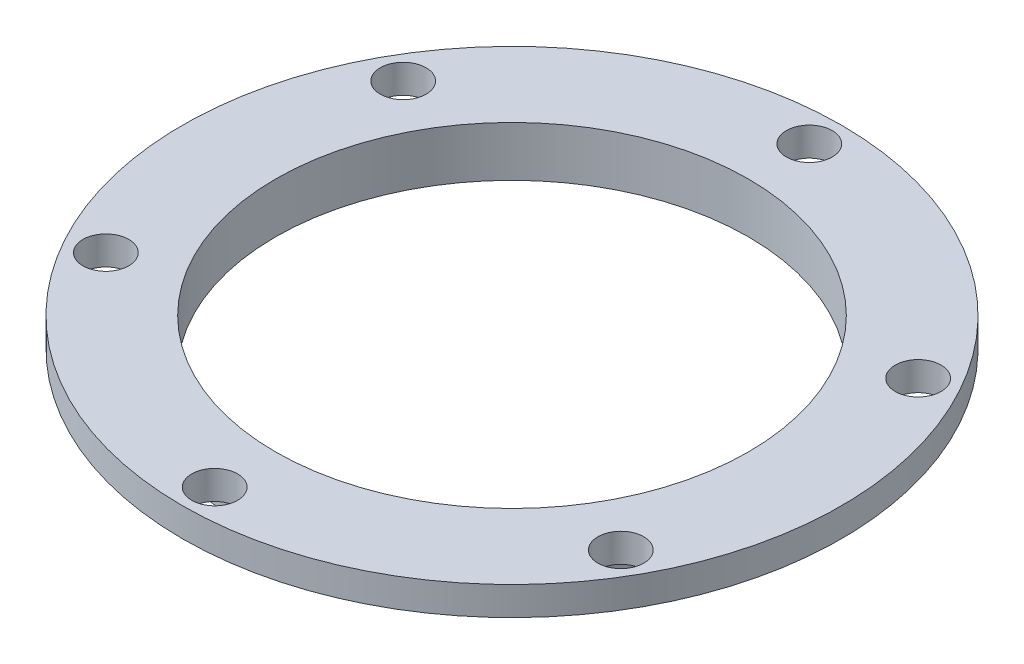
ISO-10303-21;
HEADER;
FILE_DESCRIPTION(('STEP AP214'),'2;1');
FILE_NAME('part.step','',(''),(''),'','','');
FILE_SCHEMA(('AUTOMOTIVE_DESIGN { 1 0 10303 214 1 1 1 1 }'));
ENDSEC;
DATA;
#1=APPLICATION_CONTEXT('core data for automotive mechanical design processes');
#2=APPLICATION_PROTOCOL_DEFINITION('international standard','automotive_design',2000,#1);
#3=PRODUCT_CONTEXT('',#1,'mechanical');
#4=PRODUCT('Part','Part','',(#3));
#5=PRODUCT_RELATED_PRODUCT_CATEGORY('part','',(#4));
#6=PRODUCT_DEFINITION_FORMATION('','',#4);
#7=PRODUCT_DEFINITION_CONTEXT('part definition',#1,'design');
#8=PRODUCT_DEFINITION('design','',#6,#7);
#9=PRODUCT_DEFINITION_SHAPE('','',#8);
#10=(LENGTH_UNIT() NAMED_UNIT(*) SI_UNIT(.MILLI.,.METRE.));
#11=(NAMED_UNIT(*) PLANE_ANGLE_UNIT() SI_UNIT($,.RADIAN.));
#12=(NAMED_UNIT(*) SI_UNIT($,.STERADIAN.) SOLID_ANGLE_UNIT());
#13=UNCERTAINTY_MEASURE_WITH_UNIT(LENGTH_MEASURE(1.E-05),#10,'distance_accuracy_value','');
#14=(GEOMETRIC_REPRESENTATION_CONTEXT(3) GLOBAL_UNCERTAINTY_ASSIGNED_CONTEXT((#13)) GLOBAL_UNIT_ASSIGNED_CONTEXT((#10,
#11,#12)) REPRESENTATION_CONTEXT('',''));
#15=CARTESIAN_POINT('',(0.,0.,0.));
#16=DIRECTION('',(0.,0.,1.));
#17=DIRECTION('',(1.,0.,0.));
#18=AXIS2_PLACEMENT_3D('',#15,#16,#17);
#19=CARTESIAN_POINT('',(0.,-29.3693389073312,61.));
#20=DIRECTION('',(0.,-1.,0.));
#21=DIRECTION('',(0.,0.,-1.));
#22=AXIS2_PLACEMENT_3D('',#19,#20,#21);
#23=CYLINDRICAL_SURFACE('',#22,16.5);
#24=CARTESIAN_POINT('',(0.,8.49999999999998,61.));
#25=DIRECTION('',(0.,-1.,0.));
#26=DIRECTION('',(0.,0.,-1.));
#27=AXIS2_PLACEMENT_3D('',#24,#25,#26);
#28=CIRCLE('',#27,16.5);
#29=CARTESIAN_POINT('',(0.,8.49999999999998,44.5));
#30=VERTEX_POINT('',#29);
#31=EDGE_CURVE('E85',#30,#30,#28,.T.);
#32=ORIENTED_EDGE('',*,*,#31,.T.);
#33=EDGE_LOOP('',(#32));
#34=FACE_BOUND('',#33,.T.);
#35=CARTESIAN_POINT('',(0.,12.,61.));
#36=DIRECTION('',(0.,-1.,0.));
#37=DIRECTION('',(0.,0.,-1.));
#38=AXIS2_PLACEMENT_3D('',#35,#36,#37);
#39=CIRCLE('',#38,16.5);
#40=CARTESIAN_POINT('',(0.,12.,44.5));
#41=VERTEX_POINT('',#40);
#42=EDGE_CURVE('E65',#41,#41,#39,.T.);
#43=ORIENTED_EDGE('',*,*,#42,.F.);
#44=EDGE_LOOP('',(#43));
#45=FACE_BOUND('',#44,.T.);
#46=ADVANCED_FACE('F51',(#34,#45),#23,.F.);
#47=CARTESIAN_POINT('',(0.,12.,44.5));
#48=DIRECTION('',(0.,1.,0.));
#49=DIRECTION('',(0.,0.,1.));
#50=AXIS2_PLACEMENT_3D('',#47,#48,#49);
#51=PLANE('',#50);
#52=CARTESIAN_POINT('',(0.,12.,40.25));
#53=DIRECTION('',(0.,1.,0.));
#54=DIRECTION('',(0.,0.,1.));
#55=AXIS2_PLACEMENT_3D('',#52,#53,#54);
#56=CIRCLE('',#55,1.6);
#57=CARTESIAN_POINT('',(0.,12.,41.85));
#58=VERTEX_POINT('',#57);
#59=EDGE_CURVE('E133',#58,#58,#56,.T.);
#60=ORIENTED_EDGE('',*,*,#59,.F.);
#61=EDGE_LOOP('',(#60));
#62=FACE_BOUND('',#61,.T.);
#63=CARTESIAN_POINT('',(17.9700271285271,12.,50.625));
#64=DIRECTION('',(0.,1.,0.));
#65=DIRECTION('',(0.,0.,1.));
#66=AXIS2_PLACEMENT_3D('',#63,#64,#65);
#67=CIRCLE('',#66,1.6);
#68=CARTESIAN_POINT('',(17.9700271285271,12.,52.225));
#69=VERTEX_POINT('',#68);
#70=EDGE_CURVE('E125',#69,#69,#67,.T.);
#71=ORIENTED_EDGE('',*,*,#70,.F.);
#72=EDGE_LOOP('',(#71));
#73=FACE_BOUND('',#72,.T.);
#74=CARTESIAN_POINT('',(17.9700271285271,12.,71.3750000000001));
#75=DIRECTION('',(0.,1.,0.));
#76=DIRECTION('',(0.,0.,1.));
#77=AXIS2_PLACEMENT_3D('',#74,#75,#76);
#78=CIRCLE('',#77,1.6);
#79=CARTESIAN_POINT('',(17.9700271285271,12.,72.9750000000001));
#80=VERTEX_POINT('',#79);
#81=EDGE_CURVE('E117',#80,#80,#78,.T.);
#82=ORIENTED_EDGE('',*,*,#81,.F.);
#83=EDGE_LOOP('',(#82));
#84=FACE_BOUND('',#83,.T.);
#85=CARTESIAN_POINT('',(-1.4489647556199E-13,12.,81.75));
#86=DIRECTION('',(0.,1.,0.));
#87=DIRECTION('',(0.,0.,1.));
#88=AXIS2_PLACEMENT_3D('',#85,#86,#87);
#89=CIRCLE('',#88,1.6);
#90=CARTESIAN_POINT('',(-1.4489647556199E-13,12.,83.35));
#91=VERTEX_POINT('',#90);
#92=EDGE_CURVE('E109',#91,#91,#89,.T.);
#93=ORIENTED_EDGE('',*,*,#92,.F.);
#94=EDGE_LOOP('',(#93));
#95=FACE_BOUND('',#94,.T.);
#96=CARTESIAN_POINT('',(-17.9700271285272,12.,71.3749999999998));
#97=DIRECTION('',(0.,1.,0.));
#98=DIRECTION('',(0.,0.,1.));
#99=AXIS2_PLACEMENT_3D('',#96,#97,#98);
#100=CIRCLE('',#99,1.6);
#101=CARTESIAN_POINT('',(-17.9700271285272,12.,72.9749999999999));
#102=VERTEX_POINT('',#101);
#103=EDGE_CURVE('E101',#102,#102,#100,.T.);
#104=ORIENTED_EDGE('',*,*,#103,.F.);
#105=EDGE_LOOP('',(#104));
#106=FACE_BOUND('',#105,.T.);
#107=CARTESIAN_POINT('',(-17.970027128527,12.,50.6249999999998));
#108=DIRECTION('',(0.,1.,0.));
#109=DIRECTION('',(0.,0.,1.));
#110=AXIS2_PLACEMENT_3D('',#107,#108,#109);
#111=CIRCLE('',#110,1.6);
#112=CARTESIAN_POINT('',(-17.970027128527,12.,52.2249999999998));
#113=VERTEX_POINT('',#112);
#114=EDGE_CURVE('E93',#113,#113,#111,.T.);
#115=ORIENTED_EDGE('',*,*,#114,.F.);
#116=EDGE_LOOP('',(#115));
#117=FACE_BOUND('',#116,.T.);
#118=ORIENTED_EDGE('',*,*,#42,.T.);
#119=EDGE_LOOP('',(#118));
#120=FACE_BOUND('',#119,.T.);
#121=CARTESIAN_POINT('',(0.,12.,61.));
#122=DIRECTION('',(0.,-1.,0.));
#123=DIRECTION('',(0.,0.,-1.));
#124=AXIS2_PLACEMENT_3D('',#121,#122,#123);
#125=CIRCLE('',#124,23.);
#126=CARTESIAN_POINT('',(0.,12.,38.));
#127=VERTEX_POINT('',#126);
#128=EDGE_CURVE('E71',#127,#127,#125,.T.);
#129=ORIENTED_EDGE('',*,*,#128,.F.);
#130=EDGE_LOOP('',(#129));
#131=FACE_BOUND('',#130,.T.);
#132=ADVANCED_FACE('F142',(#62,#73,#84,#95,#106,#117,#120,#131),#51,.T.);
#133=CARTESIAN_POINT('',(0.,-29.3693389073312,61.));
#134=DIRECTION('',(0.,-1.,0.));
#135=DIRECTION('',(0.,0.,-1.));
#136=AXIS2_PLACEMENT_3D('',#133,#134,#135);
#137=CYLINDRICAL_SURFACE('',#136,23.);
#138=ORIENTED_EDGE('',*,*,#128,.T.);
#139=EDGE_LOOP('',(#138));
#140=FACE_BOUND('',#139,.T.);
#141=CARTESIAN_POINT('',(0.,9.99999999999998,61.));
#142=DIRECTION('',(0.,-1.,0.));
#143=DIRECTION('',(0.,0.,-1.));
#144=AXIS2_PLACEMENT_3D('',#141,#142,#143);
#145=CIRCLE('',#144,23.);
#146=CARTESIAN_POINT('',(0.,9.99999999999998,38.));
#147=VERTEX_POINT('',#146);
#148=EDGE_CURVE('E77',#147,#147,#145,.T.);
#149=ORIENTED_EDGE('',*,*,#148,.F.);
#150=EDGE_LOOP('',(#149));
#151=FACE_BOUND('',#150,.T.);
#152=ADVANCED_FACE('F145',(#140,#151),#137,.T.);
#153=CARTESIAN_POINT('',(0.,9.99999999999998,38.));
#154=DIRECTION('',(0.,-1.,0.));
#155=DIRECTION('',(0.,0.,-1.));
#156=AXIS2_PLACEMENT_3D('',#153,#154,#155);
#157=PLANE('',#156);
#158=CARTESIAN_POINT('',(0.,9.99999999999998,61.));
#159=DIRECTION('',(0.,-1.,0.));
#160=DIRECTION('',(0.,0.,-1.));
#161=AXIS2_PLACEMENT_3D('',#158,#159,#160);
#162=CIRCLE('',#161,18.9);
#163=CARTESIAN_POINT('',(0.,9.99999999999998,42.1));
#164=VERTEX_POINT('',#163);
#165=EDGE_CURVE('E10',#164,#164,#162,.F.);
#166=ORIENTED_EDGE('',*,*,#165,.T.);
#167=EDGE_LOOP('',(#166));
#168=FACE_BOUND('',#167,.T.);
#169=CARTESIAN_POINT('',(0.,9.99999999999998,40.25));
#170=DIRECTION('',(0.,-1.,0.));
#171=DIRECTION('',(0.,0.,-1.));
#172=AXIS2_PLACEMENT_3D('',#169,#170,#171);
#173=CIRCLE('',#172,1.6);
#174=CARTESIAN_POINT('',(0.,9.99999999999998,38.65));
#175=VERTEX_POINT('',#174);
#176=EDGE_CURVE('E129',#175,#175,#173,.T.);
#177=ORIENTED_EDGE('',*,*,#176,.F.);
#178=EDGE_LOOP('',(#177));
#179=FACE_BOUND('',#178,.T.);
#180=CARTESIAN_POINT('',(17.9700271285271,9.99999999999998,50.625));
#181=DIRECTION('',(0.,-1.,0.));
#182=DIRECTION('',(0.,0.,-1.));
#183=AXIS2_PLACEMENT_3D('',#180,#181,#182);
#184=CIRCLE('',#183,1.6);
#185=CARTESIAN_POINT('',(17.9700271285271,9.99999999999998,49.025));
#186=VERTEX_POINT('',#185);
#187=EDGE_CURVE('E121',#186,#186,#184,.T.);
#188=ORIENTED_EDGE('',*,*,#187,.F.);
#189=EDGE_LOOP('',(#188));
#190=FACE_BOUND('',#189,.T.);
#191=CARTESIAN_POINT('',(17.9700271285271,9.99999999999998,71.3750000000001));
#192=DIRECTION('',(0.,-1.,0.));
#193=DIRECTION('',(0.,0.,-1.));
#194=AXIS2_PLACEMENT_3D('',#191,#192,#193);
#195=CIRCLE('',#194,1.6);
#196=CARTESIAN_POINT('',(17.9700271285271,9.99999999999998,69.7750000000001));
#197=VERTEX_POINT('',#196);
#198=EDGE_CURVE('E113',#197,#197,#195,.T.);
#199=ORIENTED_EDGE('',*,*,#198,.F.);
#200=EDGE_LOOP('',(#199));
#201=FACE_BOUND('',#200,.T.);
#202=CARTESIAN_POINT('',(-1.4489647556199E-13,9.99999999999998,81.75));
#203=DIRECTION('',(0.,-1.,0.));
#204=DIRECTION('',(0.,0.,-1.));
#205=AXIS2_PLACEMENT_3D('',#202,#203,#204);
#206=CIRCLE('',#205,1.6);
#207=CARTESIAN_POINT('',(-1.4489647556199E-13,9.99999999999998,80.15));
#208=VERTEX_POINT('',#207);
#209=EDGE_CURVE('E105',#208,#208,#206,.T.);
#210=ORIENTED_EDGE('',*,*,#209,.F.);
#211=EDGE_LOOP('',(#210));
#212=FACE_BOUND('',#211,.T.);
#213=CARTESIAN_POINT('',(-17.9700271285272,9.99999999999998,71.3749999999998));
#214=DIRECTION('',(0.,-1.,0.));
#215=DIRECTION('',(0.,0.,-1.));
#216=AXIS2_PLACEMENT_3D('',#213,#214,#215);
#217=CIRCLE('',#216,1.6);
#218=CARTESIAN_POINT('',(-17.9700271285272,9.99999999999998,69.7749999999998));
#219=VERTEX_POINT('',#218);
#220=EDGE_CURVE('E97',#219,#219,#217,.T.);
#221=ORIENTED_EDGE('',*,*,#220,.F.);
#222=EDGE_LOOP('',(#221));
#223=FACE_BOUND('',#222,.T.);
#224=CARTESIAN_POINT('',(-17.970027128527,9.99999999999998,50.6249999999998));
#225=DIRECTION('',(0.,-1.,0.));
#226=DIRECTION('',(0.,0.,-1.));
#227=AXIS2_PLACEMENT_3D('',#224,#225,#226);
#228=CIRCLE('',#227,1.6);
#229=CARTESIAN_POINT('',(-17.970027128527,9.99999999999998,49.0249999999998));
#230=VERTEX_POINT('',#229);
#231=EDGE_CURVE('E89',#230,#230,#228,.T.);
#232=ORIENTED_EDGE('',*,*,#231,.F.);
#233=EDGE_LOOP('',(#232));
#234=FACE_BOUND('',#233,.T.);
#235=ORIENTED_EDGE('',*,*,#148,.T.);
#236=EDGE_LOOP('',(#235));
#237=FACE_BOUND('',#236,.T.);
#238=ADVANCED_FACE('F163',(#168,#179,#190,#201,#212,#223,#234,#237),#157,.T.);
#239=CARTESIAN_POINT('',(0.,-29.3693389073312,61.));
#240=DIRECTION('',(0.,-1.,0.));
#241=DIRECTION('',(0.,0.,-1.));
#242=AXIS2_PLACEMENT_3D('',#239,#240,#241);
#243=CYLINDRICAL_SURFACE('',#242,18.5);
#244=CARTESIAN_POINT('',(0.,9.59999999999998,61.));
#245=DIRECTION('',(0.,-1.,0.));
#246=DIRECTION('',(0.,0.,-1.));
#247=AXIS2_PLACEMENT_3D('',#244,#245,#246);
#248=CIRCLE('',#247,18.5);
#249=CARTESIAN_POINT('',(0.,9.59999999999998,42.5));
#250=VERTEX_POINT('',#249);
#251=EDGE_CURVE('E59',#250,#250,#248,.T.);
#252=ORIENTED_EDGE('',*,*,#251,.T.);
#253=EDGE_LOOP('',(#252));
#254=FACE_BOUND('',#253,.T.);
#255=CARTESIAN_POINT('',(0.,8.49999999999998,61.));
#256=DIRECTION('',(0.,-1.,0.));
#257=DIRECTION('',(0.,0.,-1.));
#258=AXIS2_PLACEMENT_3D('',#255,#256,#257);
#259=CIRCLE('',#258,18.5);
#260=CARTESIAN_POINT('',(0.,8.49999999999998,42.5));
#261=VERTEX_POINT('',#260);
#262=EDGE_CURVE('E81',#261,#261,#259,.T.);
#263=ORIENTED_EDGE('',*,*,#262,.F.);
#264=EDGE_LOOP('',(#263));
#265=FACE_BOUND('',#264,.T.);
#266=ADVANCED_FACE('F168',(#254,#265),#243,.T.);
#267=CARTESIAN_POINT('',(0.,8.49999999999998,42.5));
#268=DIRECTION('',(0.,-1.,0.));
#269=DIRECTION('',(0.,0.,-1.));
#270=AXIS2_PLACEMENT_3D('',#267,#268,#269);
#271=PLANE('',#270);
#272=ORIENTED_EDGE('',*,*,#262,.T.);
#273=EDGE_LOOP('',(#272));
#274=FACE_BOUND('',#273,.T.);
#275=ORIENTED_EDGE('',*,*,#31,.F.);
#276=EDGE_LOOP('',(#275));
#277=FACE_BOUND('',#276,.T.);
#278=ADVANCED_FACE('F174',(#274,#277),#271,.T.);
#279=CARTESIAN_POINT('',(-17.970027128527,12.,50.6249999999998));
#280=DIRECTION('',(0.,1.,0.));
#281=DIRECTION('',(0.,0.,1.));
#282=AXIS2_PLACEMENT_3D('',#279,#280,#281);
#283=CYLINDRICAL_SURFACE('',#282,1.6);
#284=ORIENTED_EDGE('',*,*,#114,.T.);
#285=EDGE_LOOP('',(#284));
#286=FACE_BOUND('',#285,.T.);
#287=ORIENTED_EDGE('',*,*,#231,.T.);
#288=EDGE_LOOP('',(#287));
#289=FACE_BOUND('',#288,.T.);
#290=ADVANCED_FACE('F185',(#286,#289),#283,.F.);
#291=CARTESIAN_POINT('',(-17.9700271285272,12.,71.3749999999998));
#292=DIRECTION('',(0.,1.,0.));
#293=DIRECTION('',(0.,0.,1.));
#294=AXIS2_PLACEMENT_3D('',#291,#292,#293);
#295=CYLINDRICAL_SURFACE('',#294,1.6);
#296=ORIENTED_EDGE('',*,*,#103,.T.);
#297=EDGE_LOOP('',(#296));
#298=FACE_BOUND('',#297,.T.);
#299=ORIENTED_EDGE('',*,*,#220,.T.);
#300=EDGE_LOOP('',(#299));
#301=FACE_BOUND('',#300,.T.);
#302=ADVANCED_FACE('F192',(#298,#301),#295,.F.);
#303=CARTESIAN_POINT('',(-1.4489647556199E-13,12.,81.75));
#304=DIRECTION('',(0.,1.,0.));
#305=DIRECTION('',(0.,0.,1.));
#306=AXIS2_PLACEMENT_3D('',#303,#304,#305);
#307=CYLINDRICAL_SURFACE('',#306,1.6);
#308=ORIENTED_EDGE('',*,*,#92,.T.);
#309=EDGE_LOOP('',(#308));
#310=FACE_BOUND('',#309,.T.);
#311=ORIENTED_EDGE('',*,*,#209,.T.);
#312=EDGE_LOOP('',(#311));
#313=FACE_BOUND('',#312,.T.);
#314=ADVANCED_FACE('F198',(#310,#313),#307,.F.);
#315=CARTESIAN_POINT('',(17.9700271285271,12.,71.3750000000001));
#316=DIRECTION('',(0.,1.,0.));
#317=DIRECTION('',(0.,0.,1.));
#318=AXIS2_PLACEMENT_3D('',#315,#316,#317);
#319=CYLINDRICAL_SURFACE('',#318,1.6);
#320=ORIENTED_EDGE('',*,*,#81,.T.);
#321=EDGE_LOOP('',(#320));
#322=FACE_BOUND('',#321,.T.);
#323=ORIENTED_EDGE('',*,*,#198,.T.);
#324=EDGE_LOOP('',(#323));
#325=FACE_BOUND('',#324,.T.);
#326=ADVANCED_FACE('F202',(#322,#325),#319,.F.);
#327=CARTESIAN_POINT('',(17.9700271285271,12.,50.625));
#328=DIRECTION('',(0.,1.,0.));
#329=DIRECTION('',(0.,0.,1.));
#330=AXIS2_PLACEMENT_3D('',#327,#328,#329);
#331=CYLINDRICAL_SURFACE('',#330,1.6);
#332=ORIENTED_EDGE('',*,*,#70,.T.);
#333=EDGE_LOOP('',(#332));
#334=FACE_BOUND('',#333,.T.);
#335=ORIENTED_EDGE('',*,*,#187,.T.);
#336=EDGE_LOOP('',(#335));
#337=FACE_BOUND('',#336,.T.);
#338=ADVANCED_FACE('F206',(#334,#337),#331,.F.);
#339=CARTESIAN_POINT('',(0.,12.,40.25));
#340=DIRECTION('',(0.,1.,0.));
#341=DIRECTION('',(0.,0.,1.));
#342=AXIS2_PLACEMENT_3D('',#339,#340,#341);
#343=CYLINDRICAL_SURFACE('',#342,1.6);
#344=ORIENTED_EDGE('',*,*,#59,.T.);
#345=EDGE_LOOP('',(#344));
#346=FACE_BOUND('',#345,.T.);
#347=ORIENTED_EDGE('',*,*,#176,.T.);
#348=EDGE_LOOP('',(#347));
#349=FACE_BOUND('',#348,.T.);
#350=ADVANCED_FACE('F139',(#346,#349),#343,.F.);
#351=CARTESIAN_POINT('',(0.,9.59999999999998,61.));
#352=DIRECTION('',(0.,-1.,0.));
#353=DIRECTION('',(0.,0.,-1.));
#354=AXIS2_PLACEMENT_3D('',#351,#352,#353);
#355=TOROIDAL_SURFACE('',#354,18.9,0.4);
#356=ORIENTED_EDGE('',*,*,#165,.F.);
#357=EDGE_LOOP('',(#356));
#358=FACE_BOUND('',#357,.T.);
#359=ORIENTED_EDGE('',*,*,#251,.F.);
#360=EDGE_LOOP('',(#359));
#361=FACE_BOUND('',#360,.T.);
#362=ADVANCED_FACE('F53',(#358,#361),#355,.F.);
#363=CLOSED_SHELL('',(#46,#132,#152,#238,#266,#278,#290,#302,#314,#326,#338,#350,#362));
#364=MANIFOLD_SOLID_BREP('B2',#363);
#365=ADVANCED_BREP_SHAPE_REPRESENTATION('',(#18,#364),#14);
#366=SHAPE_DEFINITION_REPRESENTATION(#9,#365);
ENDSEC;
END-ISO-10303-21;
